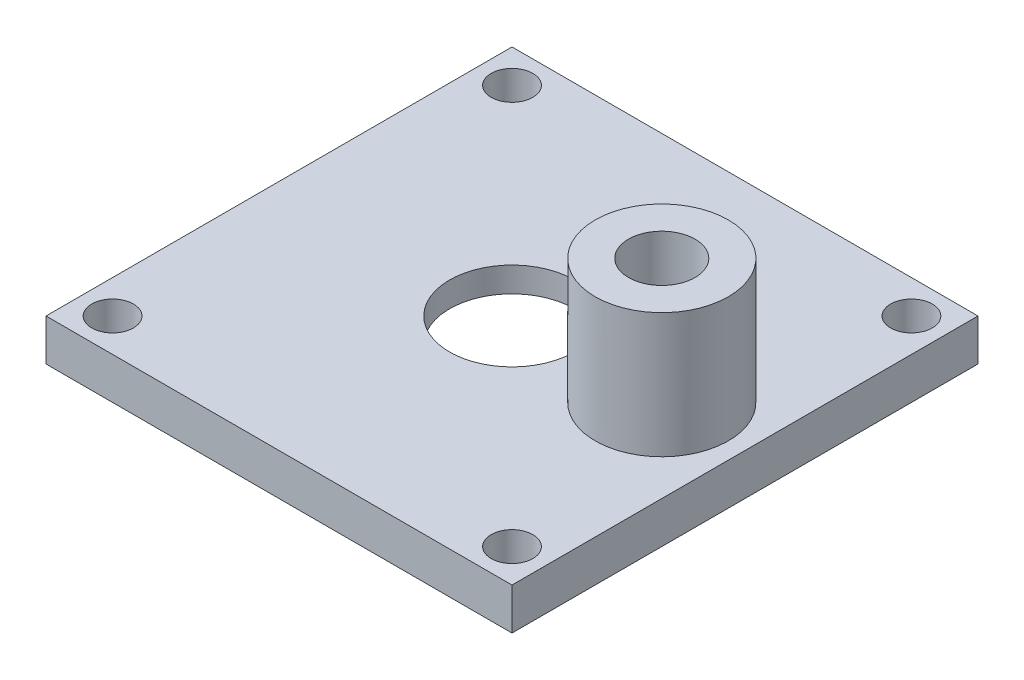
ISO-10303-21;
HEADER;
FILE_DESCRIPTION(('STEP AP214'),'2;1');
FILE_NAME('part.step','',(''),(''),'','','');
FILE_SCHEMA(('AUTOMOTIVE_DESIGN { 1 0 10303 214 1 1 1 1 }'));
ENDSEC;
DATA;
#1=APPLICATION_CONTEXT('core data for automotive mechanical design processes');
#2=APPLICATION_PROTOCOL_DEFINITION('international standard','automotive_design',2000,#1);
#3=PRODUCT_CONTEXT('',#1,'mechanical');
#4=PRODUCT('Part','Part','',(#3));
#5=PRODUCT_RELATED_PRODUCT_CATEGORY('part','',(#4));
#6=PRODUCT_DEFINITION_FORMATION('','',#4);
#7=PRODUCT_DEFINITION_CONTEXT('part definition',#1,'design');
#8=PRODUCT_DEFINITION('design','',#6,#7);
#9=PRODUCT_DEFINITION_SHAPE('','',#8);
#10=(LENGTH_UNIT() NAMED_UNIT(*) SI_UNIT(.MILLI.,.METRE.));
#11=(NAMED_UNIT(*) PLANE_ANGLE_UNIT() SI_UNIT($,.RADIAN.));
#12=(NAMED_UNIT(*) SI_UNIT($,.STERADIAN.) SOLID_ANGLE_UNIT());
#13=UNCERTAINTY_MEASURE_WITH_UNIT(LENGTH_MEASURE(1.E-05),#10,'distance_accuracy_value','');
#14=(GEOMETRIC_REPRESENTATION_CONTEXT(3) GLOBAL_UNCERTAINTY_ASSIGNED_CONTEXT((#13)) GLOBAL_UNIT_ASSIGNED_CONTEXT((#10,
#11,#12)) REPRESENTATION_CONTEXT('',''));
#15=CARTESIAN_POINT('',(0.,0.,0.));
#16=DIRECTION('',(0.,0.,1.));
#17=DIRECTION('',(1.,0.,0.));
#18=AXIS2_PLACEMENT_3D('',#15,#16,#17);
#19=CARTESIAN_POINT('',(28.,5.,28.));
#20=DIRECTION('',(-1.,0.,0.));
#21=DIRECTION('',(0.,0.,1.));
#22=AXIS2_PLACEMENT_3D('',#19,#20,#21);
#23=PLANE('',#22);
#24=DIRECTION('',(0.,0.,-1.));
#25=VECTOR('',#24,1.);
#26=CARTESIAN_POINT('',(28.,0.,28.));
#27=LINE('',#26,#25);
#28=CARTESIAN_POINT('',(28.,0.,28.));
#29=VERTEX_POINT('',#28);
#30=CARTESIAN_POINT('',(28.,0.,-28.));
#31=VERTEX_POINT('',#30);
#32=EDGE_CURVE('E111',#29,#31,#27,.T.);
#33=ORIENTED_EDGE('',*,*,#32,.T.);
#34=DIRECTION('',(0.,-1.,0.));
#35=VECTOR('',#34,1.);
#36=CARTESIAN_POINT('',(28.,5.,-28.));
#37=LINE('',#36,#35);
#38=CARTESIAN_POINT('',(28.,5.,-28.));
#39=VERTEX_POINT('',#38);
#40=EDGE_CURVE('E49',#39,#31,#37,.T.);
#41=ORIENTED_EDGE('',*,*,#40,.F.);
#42=DIRECTION('',(0.,0.,-1.));
#43=VECTOR('',#42,1.);
#44=CARTESIAN_POINT('',(28.,5.,28.));
#45=LINE('',#44,#43);
#46=CARTESIAN_POINT('',(28.,5.,28.));
#47=VERTEX_POINT('',#46);
#48=EDGE_CURVE('E93',#47,#39,#45,.T.);
#49=ORIENTED_EDGE('',*,*,#48,.F.);
#50=DIRECTION('',(0.,-1.,0.));
#51=VECTOR('',#50,1.);
#52=CARTESIAN_POINT('',(28.,5.,28.));
#53=LINE('',#52,#51);
#54=EDGE_CURVE('E107',#47,#29,#53,.T.);
#55=ORIENTED_EDGE('',*,*,#54,.T.);
#56=EDGE_LOOP('',(#33,#41,#49,#55));
#57=FACE_BOUND('',#56,.T.);
#58=ADVANCED_FACE('F39',(#57),#23,.F.);
#59=CARTESIAN_POINT('',(-28.,5.,-28.));
#60=DIRECTION('',(0.,0.,1.));
#61=DIRECTION('',(1.,0.,0.));
#62=AXIS2_PLACEMENT_3D('',#59,#60,#61);
#63=PLANE('',#62);
#64=DIRECTION('',(-1.,0.,0.));
#65=VECTOR('',#64,1.);
#66=CARTESIAN_POINT('',(-28.,0.,-28.));
#67=LINE('',#66,#65);
#68=CARTESIAN_POINT('',(-28.,0.,-28.));
#69=VERTEX_POINT('',#68);
#70=EDGE_CURVE('E99',#31,#69,#67,.T.);
#71=ORIENTED_EDGE('',*,*,#70,.T.);
#72=DIRECTION('',(0.,-1.,0.));
#73=VECTOR('',#72,1.);
#74=CARTESIAN_POINT('',(-28.,5.,-28.));
#75=LINE('',#74,#73);
#76=CARTESIAN_POINT('',(-28.,5.,-28.));
#77=VERTEX_POINT('',#76);
#78=EDGE_CURVE('E97',#77,#69,#75,.T.);
#79=ORIENTED_EDGE('',*,*,#78,.F.);
#80=DIRECTION('',(-1.,0.,0.));
#81=VECTOR('',#80,1.);
#82=CARTESIAN_POINT('',(-28.,5.,-28.));
#83=LINE('',#82,#81);
#84=EDGE_CURVE('E88',#39,#77,#83,.T.);
#85=ORIENTED_EDGE('',*,*,#84,.F.);
#86=ORIENTED_EDGE('',*,*,#40,.T.);
#87=EDGE_LOOP('',(#71,#79,#85,#86));
#88=FACE_BOUND('',#87,.T.);
#89=ADVANCED_FACE('F98',(#88),#63,.F.);
#90=CARTESIAN_POINT('',(-28.,5.,28.));
#91=DIRECTION('',(1.,0.,0.));
#92=DIRECTION('',(0.,0.,-1.));
#93=AXIS2_PLACEMENT_3D('',#90,#91,#92);
#94=PLANE('',#93);
#95=DIRECTION('',(0.,0.,1.));
#96=VECTOR('',#95,1.);
#97=CARTESIAN_POINT('',(-28.,0.,28.));
#98=LINE('',#97,#96);
#99=CARTESIAN_POINT('',(-28.,0.,28.));
#100=VERTEX_POINT('',#99);
#101=EDGE_CURVE('E74',#69,#100,#98,.T.);
#102=ORIENTED_EDGE('',*,*,#101,.T.);
#103=DIRECTION('',(0.,-1.,0.));
#104=VECTOR('',#103,1.);
#105=CARTESIAN_POINT('',(-28.,5.,28.));
#106=LINE('',#105,#104);
#107=CARTESIAN_POINT('',(-28.,5.,28.));
#108=VERTEX_POINT('',#107);
#109=EDGE_CURVE('E101',#108,#100,#106,.T.);
#110=ORIENTED_EDGE('',*,*,#109,.F.);
#111=DIRECTION('',(0.,0.,1.));
#112=VECTOR('',#111,1.);
#113=CARTESIAN_POINT('',(-28.,5.,28.));
#114=LINE('',#113,#112);
#115=EDGE_CURVE('E91',#77,#108,#114,.T.);
#116=ORIENTED_EDGE('',*,*,#115,.F.);
#117=ORIENTED_EDGE('',*,*,#78,.T.);
#118=EDGE_LOOP('',(#102,#110,#116,#117));
#119=FACE_BOUND('',#118,.T.);
#120=ADVANCED_FACE('F103',(#119),#94,.F.);
#121=CARTESIAN_POINT('',(-28.,5.,28.));
#122=DIRECTION('',(0.,0.,-1.));
#123=DIRECTION('',(-1.,0.,0.));
#124=AXIS2_PLACEMENT_3D('',#121,#122,#123);
#125=PLANE('',#124);
#126=DIRECTION('',(1.,0.,0.));
#127=VECTOR('',#126,1.);
#128=CARTESIAN_POINT('',(-28.,0.,28.));
#129=LINE('',#128,#127);
#130=EDGE_CURVE('E80',#100,#29,#129,.T.);
#131=ORIENTED_EDGE('',*,*,#130,.T.);
#132=ORIENTED_EDGE('',*,*,#54,.F.);
#133=DIRECTION('',(1.,0.,0.));
#134=VECTOR('',#133,1.);
#135=CARTESIAN_POINT('',(-28.,5.,28.));
#136=LINE('',#135,#134);
#137=EDGE_CURVE('E57',#108,#47,#136,.T.);
#138=ORIENTED_EDGE('',*,*,#137,.F.);
#139=ORIENTED_EDGE('',*,*,#109,.T.);
#140=EDGE_LOOP('',(#131,#132,#138,#139));
#141=FACE_BOUND('',#140,.T.);
#142=ADVANCED_FACE('F142',(#141),#125,.F.);
#143=CARTESIAN_POINT('',(0.,5.,0.));
#144=DIRECTION('',(0.,-1.,0.));
#145=DIRECTION('',(0.,0.,-1.));
#146=AXIS2_PLACEMENT_3D('',#143,#144,#145);
#147=PLANE('',#146);
#148=CARTESIAN_POINT('',(-23.9999999999986,5.,24.));
#149=DIRECTION('',(0.,1.,0.));
#150=DIRECTION('',(0.,0.,1.));
#151=AXIS2_PLACEMENT_3D('',#148,#149,#150);
#152=CIRCLE('',#151,2.50000000000071);
#153=CARTESIAN_POINT('',(-23.9999999999986,5.,26.5000000000007));
#154=VERTEX_POINT('',#153);
#155=EDGE_CURVE('E283',#154,#154,#152,.T.);
#156=ORIENTED_EDGE('',*,*,#155,.F.);
#157=EDGE_LOOP('',(#156));
#158=FACE_BOUND('',#157,.T.);
#159=CARTESIAN_POINT('',(24.0000000000014,5.,23.9999999999986));
#160=DIRECTION('',(0.,1.,0.));
#161=DIRECTION('',(0.,0.,1.));
#162=AXIS2_PLACEMENT_3D('',#159,#160,#161);
#163=CIRCLE('',#162,2.5000000000019);
#164=CARTESIAN_POINT('',(24.0000000000014,5.,26.5000000000005));
#165=VERTEX_POINT('',#164);
#166=EDGE_CURVE('E290',#165,#165,#163,.T.);
#167=ORIENTED_EDGE('',*,*,#166,.F.);
#168=EDGE_LOOP('',(#167));
#169=FACE_BOUND('',#168,.T.);
#170=CARTESIAN_POINT('',(24.,5.,-24.0000000000014));
#171=DIRECTION('',(0.,1.,0.));
#172=DIRECTION('',(0.,0.,1.));
#173=AXIS2_PLACEMENT_3D('',#170,#171,#172);
#174=CIRCLE('',#173,2.5000000000014);
#175=CARTESIAN_POINT('',(24.,5.,-21.5));
#176=VERTEX_POINT('',#175);
#177=EDGE_CURVE('E298',#176,#176,#174,.T.);
#178=ORIENTED_EDGE('',*,*,#177,.F.);
#179=EDGE_LOOP('',(#178));
#180=FACE_BOUND('',#179,.T.);
#181=CARTESIAN_POINT('',(-24.,5.,-24.));
#182=DIRECTION('',(0.,1.,0.));
#183=DIRECTION('',(0.,0.,1.));
#184=AXIS2_PLACEMENT_3D('',#181,#182,#183);
#185=CIRCLE('',#184,2.5);
#186=CARTESIAN_POINT('',(-24.,5.,-21.5));
#187=VERTEX_POINT('',#186);
#188=EDGE_CURVE('E275',#187,#187,#185,.T.);
#189=ORIENTED_EDGE('',*,*,#188,.F.);
#190=EDGE_LOOP('',(#189));
#191=FACE_BOUND('',#190,.T.);
#192=CARTESIAN_POINT('',(0.,5.,0.));
#193=DIRECTION('',(0.,-1.,0.));
#194=DIRECTION('',(0.,0.,-1.));
#195=AXIS2_PLACEMENT_3D('',#192,#193,#194);
#196=CIRCLE('',#195,7.5);
#197=CARTESIAN_POINT('',(0.,5.,-7.5));
#198=VERTEX_POINT('',#197);
#199=EDGE_CURVE('E263',#198,#198,#196,.T.);
#200=ORIENTED_EDGE('',*,*,#199,.T.);
#201=EDGE_LOOP('',(#200));
#202=FACE_BOUND('',#201,.T.);
#203=CARTESIAN_POINT('',(18.,5.,0.));
#204=DIRECTION('',(0.,-1.,0.));
#205=DIRECTION('',(0.,0.,-1.));
#206=AXIS2_PLACEMENT_3D('',#203,#204,#205);
#207=CIRCLE('',#206,8.);
#208=CARTESIAN_POINT('',(18.,5.,-8.));
#209=VERTEX_POINT('',#208);
#210=EDGE_CURVE('E11',#209,#209,#207,.F.);
#211=ORIENTED_EDGE('',*,*,#210,.F.);
#212=EDGE_LOOP('',(#211));
#213=FACE_BOUND('',#212,.T.);
#214=ORIENTED_EDGE('',*,*,#48,.T.);
#215=ORIENTED_EDGE('',*,*,#84,.T.);
#216=ORIENTED_EDGE('',*,*,#115,.T.);
#217=ORIENTED_EDGE('',*,*,#137,.T.);
#218=EDGE_LOOP('',(#214,#215,#216,#217));
#219=FACE_BOUND('',#218,.T.);
#220=ADVANCED_FACE('F89',(#158,#169,#180,#191,#202,#213,#219),#147,.F.);
#221=CARTESIAN_POINT('',(0.,0.,0.));
#222=DIRECTION('',(0.,-1.,0.));
#223=DIRECTION('',(0.,0.,-1.));
#224=AXIS2_PLACEMENT_3D('',#221,#222,#223);
#225=PLANE('',#224);
#226=CARTESIAN_POINT('',(-23.9999999999986,0.,24.));
#227=DIRECTION('',(0.,1.,0.));
#228=DIRECTION('',(0.,0.,1.));
#229=AXIS2_PLACEMENT_3D('',#226,#227,#228);
#230=CIRCLE('',#229,2.50000000000071);
#231=CARTESIAN_POINT('',(-23.9999999999986,0.,26.5000000000007));
#232=VERTEX_POINT('',#231);
#233=EDGE_CURVE('E287',#232,#232,#230,.T.);
#234=ORIENTED_EDGE('',*,*,#233,.T.);
#235=EDGE_LOOP('',(#234));
#236=FACE_BOUND('',#235,.T.);
#237=CARTESIAN_POINT('',(24.0000000000014,0.,23.9999999999986));
#238=DIRECTION('',(0.,1.,0.));
#239=DIRECTION('',(0.,0.,1.));
#240=AXIS2_PLACEMENT_3D('',#237,#238,#239);
#241=CIRCLE('',#240,2.5000000000019);
#242=CARTESIAN_POINT('',(24.0000000000014,0.,26.5000000000005));
#243=VERTEX_POINT('',#242);
#244=EDGE_CURVE('E294',#243,#243,#241,.T.);
#245=ORIENTED_EDGE('',*,*,#244,.T.);
#246=EDGE_LOOP('',(#245));
#247=FACE_BOUND('',#246,.T.);
#248=CARTESIAN_POINT('',(24.,0.,-24.0000000000014));
#249=DIRECTION('',(0.,1.,0.));
#250=DIRECTION('',(0.,0.,1.));
#251=AXIS2_PLACEMENT_3D('',#248,#249,#250);
#252=CIRCLE('',#251,2.5000000000014);
#253=CARTESIAN_POINT('',(24.,0.,-21.5));
#254=VERTEX_POINT('',#253);
#255=EDGE_CURVE('E279',#254,#254,#252,.T.);
#256=ORIENTED_EDGE('',*,*,#255,.T.);
#257=EDGE_LOOP('',(#256));
#258=FACE_BOUND('',#257,.T.);
#259=CARTESIAN_POINT('',(-24.,0.,-24.));
#260=DIRECTION('',(0.,1.,0.));
#261=DIRECTION('',(0.,0.,1.));
#262=AXIS2_PLACEMENT_3D('',#259,#260,#261);
#263=CIRCLE('',#262,2.5);
#264=CARTESIAN_POINT('',(-24.,0.,-21.5));
#265=VERTEX_POINT('',#264);
#266=EDGE_CURVE('E274',#265,#265,#263,.T.);
#267=ORIENTED_EDGE('',*,*,#266,.T.);
#268=EDGE_LOOP('',(#267));
#269=FACE_BOUND('',#268,.T.);
#270=CARTESIAN_POINT('',(0.,0.,0.));
#271=DIRECTION('',(0.,-1.,0.));
#272=DIRECTION('',(0.,0.,-1.));
#273=AXIS2_PLACEMENT_3D('',#270,#271,#272);
#274=CIRCLE('',#273,19.);
#275=CARTESIAN_POINT('',(0.,0.,-19.));
#276=VERTEX_POINT('',#275);
#277=EDGE_CURVE('E257',#276,#276,#274,.T.);
#278=ORIENTED_EDGE('',*,*,#277,.F.);
#279=EDGE_LOOP('',(#278));
#280=FACE_BOUND('',#279,.T.);
#281=ORIENTED_EDGE('',*,*,#32,.F.);
#282=ORIENTED_EDGE('',*,*,#130,.F.);
#283=ORIENTED_EDGE('',*,*,#101,.F.);
#284=ORIENTED_EDGE('',*,*,#70,.F.);
#285=EDGE_LOOP('',(#281,#282,#283,#284));
#286=FACE_BOUND('',#285,.T.);
#287=ADVANCED_FACE('F130',(#236,#247,#258,#269,#280,#286),#225,.T.);
#288=CARTESIAN_POINT('',(18.,20.,0.));
#289=DIRECTION('',(0.,-1.,0.));
#290=DIRECTION('',(0.,0.,-1.));
#291=AXIS2_PLACEMENT_3D('',#288,#289,#290);
#292=CYLINDRICAL_SURFACE('',#291,8.);
#293=CARTESIAN_POINT('',(18.,20.,0.));
#294=DIRECTION('',(0.,1.,0.));
#295=DIRECTION('',(0.,0.,1.));
#296=AXIS2_PLACEMENT_3D('',#293,#294,#295);
#297=CIRCLE('',#296,8.);
#298=CARTESIAN_POINT('',(18.,20.,8.));
#299=VERTEX_POINT('',#298);
#300=EDGE_CURVE('E115',#299,#299,#297,.T.);
#301=ORIENTED_EDGE('',*,*,#300,.F.);
#302=EDGE_LOOP('',(#301));
#303=FACE_BOUND('',#302,.T.);
#304=ORIENTED_EDGE('',*,*,#210,.T.);
#305=EDGE_LOOP('',(#304));
#306=FACE_BOUND('',#305,.T.);
#307=ADVANCED_FACE('F132',(#303,#306),#292,.T.);
#308=CARTESIAN_POINT('',(18.,20.,0.));
#309=DIRECTION('',(0.,1.,0.));
#310=DIRECTION('',(0.,0.,1.));
#311=AXIS2_PLACEMENT_3D('',#308,#309,#310);
#312=PLANE('',#311);
#313=CARTESIAN_POINT('',(18.,20.,0.));
#314=DIRECTION('',(0.,1.,0.));
#315=DIRECTION('',(0.,0.,1.));
#316=AXIS2_PLACEMENT_3D('',#313,#314,#315);
#317=CIRCLE('',#316,4.);
#318=CARTESIAN_POINT('',(18.,20.,4.));
#319=VERTEX_POINT('',#318);
#320=EDGE_CURVE('E249',#319,#319,#317,.T.);
#321=ORIENTED_EDGE('',*,*,#320,.F.);
#322=EDGE_LOOP('',(#321));
#323=FACE_BOUND('',#322,.T.);
#324=ORIENTED_EDGE('',*,*,#300,.T.);
#325=EDGE_LOOP('',(#324));
#326=FACE_BOUND('',#325,.T.);
#327=ADVANCED_FACE('F139',(#323,#326),#312,.T.);
#328=CARTESIAN_POINT('',(0.,2.,0.));
#329=DIRECTION('',(0.,-1.,0.));
#330=DIRECTION('',(0.,0.,-1.));
#331=AXIS2_PLACEMENT_3D('',#328,#329,#330);
#332=CYLINDRICAL_SURFACE('',#331,19.);
#333=CARTESIAN_POINT('',(0.,2.,0.));
#334=DIRECTION('',(0.,-1.,0.));
#335=DIRECTION('',(0.,0.,-1.));
#336=AXIS2_PLACEMENT_3D('',#333,#334,#335);
#337=CIRCLE('',#336,19.);
#338=CARTESIAN_POINT('',(0.,2.,-19.));
#339=VERTEX_POINT('',#338);
#340=EDGE_CURVE('E253',#339,#339,#337,.T.);
#341=ORIENTED_EDGE('',*,*,#340,.F.);
#342=EDGE_LOOP('',(#341));
#343=FACE_BOUND('',#342,.T.);
#344=ORIENTED_EDGE('',*,*,#277,.T.);
#345=EDGE_LOOP('',(#344));
#346=FACE_BOUND('',#345,.T.);
#347=ADVANCED_FACE('F237',(#343,#346),#332,.F.);
#348=CARTESIAN_POINT('',(0.,2.,0.));
#349=DIRECTION('',(0.,-1.,0.));
#350=DIRECTION('',(0.,0.,-1.));
#351=AXIS2_PLACEMENT_3D('',#348,#349,#350);
#352=PLANE('',#351);
#353=CARTESIAN_POINT('',(0.,2.,0.));
#354=DIRECTION('',(0.,-1.,0.));
#355=DIRECTION('',(0.,0.,-1.));
#356=AXIS2_PLACEMENT_3D('',#353,#354,#355);
#357=CIRCLE('',#356,7.5);
#358=CARTESIAN_POINT('',(0.,2.,-7.5));
#359=VERTEX_POINT('',#358);
#360=EDGE_CURVE('E42',#359,#359,#357,.T.);
#361=ORIENTED_EDGE('',*,*,#360,.F.);
#362=EDGE_LOOP('',(#361));
#363=FACE_BOUND('',#362,.T.);
#364=ORIENTED_EDGE('',*,*,#340,.T.);
#365=EDGE_LOOP('',(#364));
#366=FACE_BOUND('',#365,.T.);
#367=ADVANCED_FACE('F233',(#363,#366),#352,.T.);
#368=CARTESIAN_POINT('',(0.,20.,0.));
#369=DIRECTION('',(0.,-1.,0.));
#370=DIRECTION('',(0.,0.,-1.));
#371=AXIS2_PLACEMENT_3D('',#368,#369,#370);
#372=CYLINDRICAL_SURFACE('',#371,7.5);
#373=ORIENTED_EDGE('',*,*,#360,.T.);
#374=EDGE_LOOP('',(#373));
#375=FACE_BOUND('',#374,.T.);
#376=ORIENTED_EDGE('',*,*,#199,.F.);
#377=EDGE_LOOP('',(#376));
#378=FACE_BOUND('',#377,.T.);
#379=ADVANCED_FACE('F229',(#375,#378),#372,.F.);
#380=CARTESIAN_POINT('',(0.,5.,0.));
#381=DIRECTION('',(0.,-1.,0.));
#382=DIRECTION('',(0.,0.,-1.));
#383=AXIS2_PLACEMENT_3D('',#380,#381,#382);
#384=PLANE('',#383);
#385=CARTESIAN_POINT('',(18.,5.,0.));
#386=DIRECTION('',(0.,-1.,0.));
#387=DIRECTION('',(0.,0.,-1.));
#388=AXIS2_PLACEMENT_3D('',#385,#386,#387);
#389=CIRCLE('',#388,4.);
#390=CARTESIAN_POINT('',(18.,5.,-4.));
#391=VERTEX_POINT('',#390);
#392=EDGE_CURVE('E268',#391,#391,#389,.F.);
#393=ORIENTED_EDGE('',*,*,#392,.T.);
#394=EDGE_LOOP('',(#393));
#395=FACE_BOUND('',#394,.T.);
#396=ADVANCED_FACE('F225',(#395),#384,.F.);
#397=CARTESIAN_POINT('',(18.,-6.31370849898476,0.));
#398=DIRECTION('',(0.,1.,0.));
#399=DIRECTION('',(0.,0.,1.));
#400=AXIS2_PLACEMENT_3D('',#397,#398,#399);
#401=CYLINDRICAL_SURFACE('',#400,4.);
#402=ORIENTED_EDGE('',*,*,#320,.T.);
#403=EDGE_LOOP('',(#402));
#404=FACE_BOUND('',#403,.T.);
#405=ORIENTED_EDGE('',*,*,#392,.F.);
#406=EDGE_LOOP('',(#405));
#407=FACE_BOUND('',#406,.T.);
#408=ADVANCED_FACE('F172',(#404,#407),#401,.F.);
#409=CARTESIAN_POINT('',(-24.,0.,-24.));
#410=DIRECTION('',(0.,1.,0.));
#411=DIRECTION('',(0.,0.,1.));
#412=AXIS2_PLACEMENT_3D('',#409,#410,#411);
#413=CYLINDRICAL_SURFACE('',#412,2.5);
#414=ORIENTED_EDGE('',*,*,#266,.F.);
#415=EDGE_LOOP('',(#414));
#416=FACE_BOUND('',#415,.T.);
#417=ORIENTED_EDGE('',*,*,#188,.T.);
#418=EDGE_LOOP('',(#417));
#419=FACE_BOUND('',#418,.T.);
#420=ADVANCED_FACE('F182',(#416,#419),#413,.F.);
#421=CARTESIAN_POINT('',(24.,0.,-24.0000000000014));
#422=DIRECTION('',(0.,1.,0.));
#423=DIRECTION('',(0.,0.,1.));
#424=AXIS2_PLACEMENT_3D('',#421,#422,#423);
#425=CYLINDRICAL_SURFACE('',#424,2.5000000000014);
#426=ORIENTED_EDGE('',*,*,#255,.F.);
#427=EDGE_LOOP('',(#426));
#428=FACE_BOUND('',#427,.T.);
#429=ORIENTED_EDGE('',*,*,#177,.T.);
#430=EDGE_LOOP('',(#429));
#431=FACE_BOUND('',#430,.T.);
#432=ADVANCED_FACE('F187',(#428,#431),#425,.F.);
#433=CARTESIAN_POINT('',(24.0000000000014,0.,23.9999999999986));
#434=DIRECTION('',(0.,1.,0.));
#435=DIRECTION('',(0.,0.,1.));
#436=AXIS2_PLACEMENT_3D('',#433,#434,#435);
#437=CYLINDRICAL_SURFACE('',#436,2.5000000000019);
#438=ORIENTED_EDGE('',*,*,#244,.F.);
#439=EDGE_LOOP('',(#438));
#440=FACE_BOUND('',#439,.T.);
#441=ORIENTED_EDGE('',*,*,#166,.T.);
#442=EDGE_LOOP('',(#441));
#443=FACE_BOUND('',#442,.T.);
#444=ADVANCED_FACE('F197',(#440,#443),#437,.F.);
#445=CARTESIAN_POINT('',(-23.9999999999986,0.,24.));
#446=DIRECTION('',(0.,1.,0.));
#447=DIRECTION('',(0.,0.,1.));
#448=AXIS2_PLACEMENT_3D('',#445,#446,#447);
#449=CYLINDRICAL_SURFACE('',#448,2.50000000000071);
#450=ORIENTED_EDGE('',*,*,#233,.F.);
#451=EDGE_LOOP('',(#450));
#452=FACE_BOUND('',#451,.T.);
#453=ORIENTED_EDGE('',*,*,#155,.T.);
#454=EDGE_LOOP('',(#453));
#455=FACE_BOUND('',#454,.T.);
#456=ADVANCED_FACE('F207',(#452,#455),#449,.F.);
#457=CLOSED_SHELL('',(#58,#89,#120,#142,#220,#287,#307,#327,#347,#367,#379,#396,#408,#420,#432,
#444,#456));
#458=MANIFOLD_SOLID_BREP('B2',#457);
#459=ADVANCED_BREP_SHAPE_REPRESENTATION('',(#18,#458),#14);
#460=SHAPE_DEFINITION_REPRESENTATION(#9,#459);
ENDSEC;
END-ISO-10303-21;
